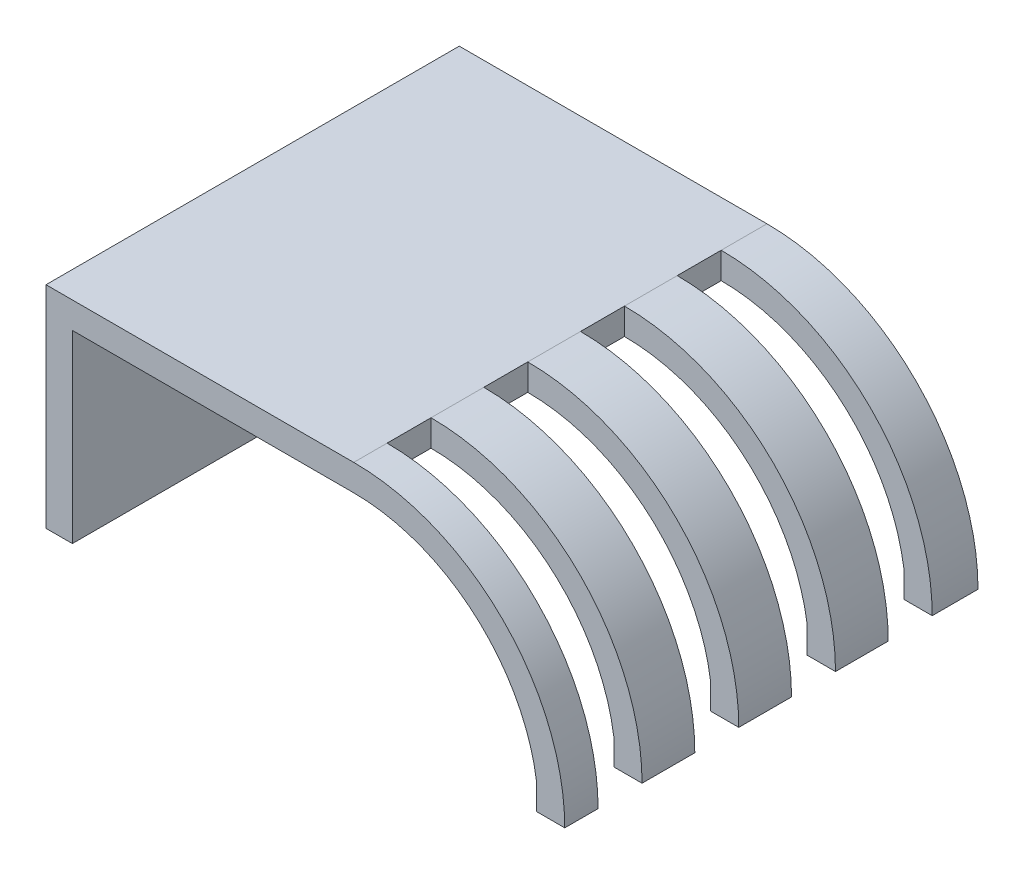
ISO-10303-21;
HEADER;
FILE_DESCRIPTION(('STEP AP214'),'2;1');
FILE_NAME('part.step','',(''),(''),'','','');
FILE_SCHEMA(('AUTOMOTIVE_DESIGN { 1 0 10303 214 1 1 1 1 }'));
ENDSEC;
DATA;
#1=APPLICATION_CONTEXT('core data for automotive mechanical design processes');
#2=APPLICATION_PROTOCOL_DEFINITION('international standard','automotive_design',2000,#1);
#3=PRODUCT_CONTEXT('',#1,'mechanical');
#4=PRODUCT('Part','Part','',(#3));
#5=PRODUCT_RELATED_PRODUCT_CATEGORY('part','',(#4));
#6=PRODUCT_DEFINITION_FORMATION('','',#4);
#7=PRODUCT_DEFINITION_CONTEXT('part definition',#1,'design');
#8=PRODUCT_DEFINITION('design','',#6,#7);
#9=PRODUCT_DEFINITION_SHAPE('','',#8);
#10=(LENGTH_UNIT() NAMED_UNIT(*) SI_UNIT(.MILLI.,.METRE.));
#11=(NAMED_UNIT(*) PLANE_ANGLE_UNIT() SI_UNIT($,.RADIAN.));
#12=(NAMED_UNIT(*) SI_UNIT($,.STERADIAN.) SOLID_ANGLE_UNIT());
#13=UNCERTAINTY_MEASURE_WITH_UNIT(LENGTH_MEASURE(1.E-05),#10,'distance_accuracy_value','');
#14=(GEOMETRIC_REPRESENTATION_CONTEXT(3) GLOBAL_UNCERTAINTY_ASSIGNED_CONTEXT((#13)) GLOBAL_UNIT_ASSIGNED_CONTEXT((#10,
#11,#12)) REPRESENTATION_CONTEXT('',''));
#15=CARTESIAN_POINT('',(0.,0.,0.));
#16=DIRECTION('',(0.,0.,1.));
#17=DIRECTION('',(1.,0.,0.));
#18=AXIS2_PLACEMENT_3D('',#15,#16,#17);
#19=CARTESIAN_POINT('',(0.,0.,0.));
#20=DIRECTION('',(0.,1.,0.));
#21=DIRECTION('',(0.,0.,1.));
#22=AXIS2_PLACEMENT_3D('',#19,#20,#21);
#23=PLANE('',#22);
#24=DIRECTION('',(0.,0.,1.));
#25=VECTOR('',#24,1.);
#26=CARTESIAN_POINT('',(12.,0.,-11.75));
#27=LINE('',#26,#25);
#28=CARTESIAN_POINT('',(12.,0.,-1.14583034009977));
#29=VERTEX_POINT('',#28);
#30=CARTESIAN_POINT('',(12.,0.,1.85416965990023));
#31=VERTEX_POINT('',#30);
#32=EDGE_CURVE('E514',#29,#31,#27,.T.);
#33=ORIENTED_EDGE('',*,*,#32,.T.);
#34=DIRECTION('',(-1.,0.,0.));
#35=VECTOR('',#34,1.);
#36=CARTESIAN_POINT('',(0.,0.,1.85416965990023));
#37=LINE('',#36,#35);
#38=CARTESIAN_POINT('',(10.3923048454133,0.,1.85416965990023));
#39=VERTEX_POINT('',#38);
#40=EDGE_CURVE('E229',#31,#39,#37,.T.);
#41=ORIENTED_EDGE('',*,*,#40,.T.);
#42=DIRECTION('',(0.,0.,-1.));
#43=VECTOR('',#42,1.);
#44=CARTESIAN_POINT('',(10.3923048454133,0.,0.));
#45=LINE('',#44,#43);
#46=CARTESIAN_POINT('',(10.3923048454133,0.,-1.14583034009977));
#47=VERTEX_POINT('',#46);
#48=EDGE_CURVE('E462',#39,#47,#45,.T.);
#49=ORIENTED_EDGE('',*,*,#48,.T.);
#50=DIRECTION('',(1.,0.,0.));
#51=VECTOR('',#50,1.);
#52=CARTESIAN_POINT('',(0.,0.,-1.14583034009977));
#53=LINE('',#52,#51);
#54=EDGE_CURVE('E289',#47,#29,#53,.T.);
#55=ORIENTED_EDGE('',*,*,#54,.T.);
#56=EDGE_LOOP('',(#33,#41,#49,#55));
#57=FACE_BOUND('',#56,.T.);
#58=ADVANCED_FACE('F32',(#57),#23,.F.);
#59=CARTESIAN_POINT('',(12.,0.,-6.64583034009977));
#60=VERTEX_POINT('',#59);
#61=CARTESIAN_POINT('',(12.,0.,-3.64583034009977));
#62=VERTEX_POINT('',#61);
#63=EDGE_CURVE('E513',#60,#62,#27,.T.);
#64=ORIENTED_EDGE('',*,*,#63,.T.);
#65=DIRECTION('',(-1.,0.,0.));
#66=VECTOR('',#65,1.);
#67=CARTESIAN_POINT('',(0.,0.,-3.64583034009977));
#68=LINE('',#67,#66);
#69=CARTESIAN_POINT('',(10.3923048454133,0.,-3.64583034009977));
#70=VERTEX_POINT('',#69);
#71=EDGE_CURVE('E293',#62,#70,#68,.T.);
#72=ORIENTED_EDGE('',*,*,#71,.T.);
#73=CARTESIAN_POINT('',(10.3923048454133,0.,-6.64583034009977));
#74=VERTEX_POINT('',#73);
#75=EDGE_CURVE('E464',#70,#74,#45,.T.);
#76=ORIENTED_EDGE('',*,*,#75,.T.);
#77=DIRECTION('',(1.,0.,0.));
#78=VECTOR('',#77,1.);
#79=CARTESIAN_POINT('',(0.,0.,-6.64583034009977));
#80=LINE('',#79,#78);
#81=EDGE_CURVE('E302',#74,#60,#80,.T.);
#82=ORIENTED_EDGE('',*,*,#81,.T.);
#83=EDGE_LOOP('',(#64,#72,#76,#82));
#84=FACE_BOUND('',#83,.T.);
#85=ADVANCED_FACE('F576',(#84),#23,.F.);
#86=CARTESIAN_POINT('',(12.,0.,-11.75));
#87=VERTEX_POINT('',#86);
#88=CARTESIAN_POINT('',(12.,0.,-9.14583034009977));
#89=VERTEX_POINT('',#88);
#90=EDGE_CURVE('E263',#87,#89,#27,.T.);
#91=ORIENTED_EDGE('',*,*,#90,.T.);
#92=DIRECTION('',(-1.,0.,0.));
#93=VECTOR('',#92,1.);
#94=CARTESIAN_POINT('',(0.,0.,-9.14583034009977));
#95=LINE('',#94,#93);
#96=CARTESIAN_POINT('',(10.3923048454133,0.,-9.14583034009977));
#97=VERTEX_POINT('',#96);
#98=EDGE_CURVE('E305',#89,#97,#95,.T.);
#99=ORIENTED_EDGE('',*,*,#98,.T.);
#100=CARTESIAN_POINT('',(10.3923048454133,0.,-11.75));
#101=VERTEX_POINT('',#100);
#102=EDGE_CURVE('E359',#97,#101,#45,.T.);
#103=ORIENTED_EDGE('',*,*,#102,.T.);
#104=DIRECTION('',(-1.,0.,0.));
#105=VECTOR('',#104,1.);
#106=CARTESIAN_POINT('',(-17.5,0.,-11.75));
#107=LINE('',#106,#105);
#108=EDGE_CURVE('E270',#87,#101,#107,.T.);
#109=ORIENTED_EDGE('',*,*,#108,.F.);
#110=EDGE_LOOP('',(#91,#99,#103,#109));
#111=FACE_BOUND('',#110,.T.);
#112=ADVANCED_FACE('F477',(#111),#23,.F.);
#113=CARTESIAN_POINT('',(0.,0.,-11.75));
#114=DIRECTION('',(0.,0.,1.));
#115=DIRECTION('',(1.,0.,0.));
#116=AXIS2_PLACEMENT_3D('',#113,#114,#115);
#117=CYLINDRICAL_SURFACE('',#116,12.);
#118=CARTESIAN_POINT('',(0.,0.,1.85416965990023));
#119=DIRECTION('',(0.,0.,-1.));
#120=DIRECTION('',(-1.,0.,0.));
#121=AXIS2_PLACEMENT_3D('',#118,#119,#120);
#122=CIRCLE('',#121,12.);
#123=CARTESIAN_POINT('',(0.,12.,1.85416965990023));
#124=VERTEX_POINT('',#123);
#125=EDGE_CURVE('E331',#31,#124,#122,.F.);
#126=ORIENTED_EDGE('',*,*,#125,.F.);
#127=ORIENTED_EDGE('',*,*,#32,.F.);
#128=CARTESIAN_POINT('',(0.,0.,-1.14583034009977));
#129=DIRECTION('',(0.,0.,1.));
#130=DIRECTION('',(1.,0.,0.));
#131=AXIS2_PLACEMENT_3D('',#128,#129,#130);
#132=CIRCLE('',#131,12.);
#133=CARTESIAN_POINT('',(0.,12.,-1.14583034009977));
#134=VERTEX_POINT('',#133);
#135=EDGE_CURVE('E322',#134,#29,#132,.F.);
#136=ORIENTED_EDGE('',*,*,#135,.F.);
#137=DIRECTION('',(0.,0.,1.));
#138=VECTOR('',#137,1.);
#139=CARTESIAN_POINT('',(0.,12.,-11.75));
#140=LINE('',#139,#138);
#141=EDGE_CURVE('E258',#134,#124,#140,.T.);
#142=ORIENTED_EDGE('',*,*,#141,.T.);
#143=EDGE_LOOP('',(#126,#127,#136,#142));
#144=FACE_BOUND('',#143,.T.);
#145=ADVANCED_FACE('F519',(#144),#117,.T.);
#146=CARTESIAN_POINT('',(0.,0.,-3.64583034009977));
#147=DIRECTION('',(0.,0.,-1.));
#148=DIRECTION('',(-1.,0.,0.));
#149=AXIS2_PLACEMENT_3D('',#146,#147,#148);
#150=CIRCLE('',#149,12.);
#151=CARTESIAN_POINT('',(0.,12.,-3.64583034009977));
#152=VERTEX_POINT('',#151);
#153=EDGE_CURVE('E279',#62,#152,#150,.F.);
#154=ORIENTED_EDGE('',*,*,#153,.F.);
#155=ORIENTED_EDGE('',*,*,#63,.F.);
#156=CARTESIAN_POINT('',(0.,0.,-6.64583034009977));
#157=DIRECTION('',(0.,0.,1.));
#158=DIRECTION('',(1.,0.,0.));
#159=AXIS2_PLACEMENT_3D('',#156,#157,#158);
#160=CIRCLE('',#159,12.);
#161=CARTESIAN_POINT('',(0.,12.,-6.64583034009977));
#162=VERTEX_POINT('',#161);
#163=EDGE_CURVE('E281',#162,#60,#160,.F.);
#164=ORIENTED_EDGE('',*,*,#163,.F.);
#165=EDGE_CURVE('E262',#162,#152,#140,.T.);
#166=ORIENTED_EDGE('',*,*,#165,.T.);
#167=EDGE_LOOP('',(#154,#155,#164,#166));
#168=FACE_BOUND('',#167,.T.);
#169=ADVANCED_FACE('F277',(#168),#117,.T.);
#170=CARTESIAN_POINT('',(0.,0.,-9.14583034009977));
#171=DIRECTION('',(0.,0.,-1.));
#172=DIRECTION('',(-1.,0.,0.));
#173=AXIS2_PLACEMENT_3D('',#170,#171,#172);
#174=CIRCLE('',#173,12.);
#175=CARTESIAN_POINT('',(0.,12.,-9.14583034009977));
#176=VERTEX_POINT('',#175);
#177=EDGE_CURVE('E317',#89,#176,#174,.F.);
#178=ORIENTED_EDGE('',*,*,#177,.F.);
#179=ORIENTED_EDGE('',*,*,#90,.F.);
#180=CARTESIAN_POINT('',(0.,0.,-11.75));
#181=DIRECTION('',(0.,0.,1.));
#182=DIRECTION('',(1.,0.,0.));
#183=AXIS2_PLACEMENT_3D('',#180,#181,#182);
#184=CIRCLE('',#183,12.);
#185=CARTESIAN_POINT('',(0.,12.,-11.75));
#186=VERTEX_POINT('',#185);
#187=EDGE_CURVE('E401',#87,#186,#184,.T.);
#188=ORIENTED_EDGE('',*,*,#187,.T.);
#189=EDGE_CURVE('E261',#186,#176,#140,.T.);
#190=ORIENTED_EDGE('',*,*,#189,.T.);
#191=EDGE_LOOP('',(#178,#179,#188,#190));
#192=FACE_BOUND('',#191,.T.);
#193=ADVANCED_FACE('F485',(#192),#117,.T.);
#194=CARTESIAN_POINT('',(0.,0.,-11.75));
#195=DIRECTION('',(0.,0.,1.));
#196=DIRECTION('',(1.,0.,0.));
#197=AXIS2_PLACEMENT_3D('',#194,#195,#196);
#198=CYLINDRICAL_SURFACE('',#197,10.5);
#199=DIRECTION('',(0.,0.,1.));
#200=VECTOR('',#199,1.);
#201=CARTESIAN_POINT('',(10.3923048454133,1.5,-11.75));
#202=LINE('',#201,#200);
#203=CARTESIAN_POINT('',(10.3923048454133,1.5,-1.14583034009977));
#204=VERTEX_POINT('',#203);
#205=CARTESIAN_POINT('',(10.3923048454133,1.5,1.85416965990023));
#206=VERTEX_POINT('',#205);
#207=EDGE_CURVE('E529',#204,#206,#202,.T.);
#208=ORIENTED_EDGE('',*,*,#207,.T.);
#209=CARTESIAN_POINT('',(0.,0.,1.85416965990023));
#210=DIRECTION('',(0.,0.,-1.));
#211=DIRECTION('',(-1.,0.,0.));
#212=AXIS2_PLACEMENT_3D('',#209,#210,#211);
#213=CIRCLE('',#212,10.5);
#214=CARTESIAN_POINT('',(0.,10.5,1.85416965990023));
#215=VERTEX_POINT('',#214);
#216=EDGE_CURVE('E250',#206,#215,#213,.F.);
#217=ORIENTED_EDGE('',*,*,#216,.T.);
#218=DIRECTION('',(0.,0.,1.));
#219=VECTOR('',#218,1.);
#220=CARTESIAN_POINT('',(0.,10.5,-11.75));
#221=LINE('',#220,#219);
#222=CARTESIAN_POINT('',(0.,10.5,-1.14583034009977));
#223=VERTEX_POINT('',#222);
#224=EDGE_CURVE('E546',#223,#215,#221,.T.);
#225=ORIENTED_EDGE('',*,*,#224,.F.);
#226=CARTESIAN_POINT('',(0.,0.,-1.14583034009977));
#227=DIRECTION('',(0.,0.,1.));
#228=DIRECTION('',(1.,0.,0.));
#229=AXIS2_PLACEMENT_3D('',#226,#227,#228);
#230=CIRCLE('',#229,10.5);
#231=EDGE_CURVE('E319',#223,#204,#230,.F.);
#232=ORIENTED_EDGE('',*,*,#231,.T.);
#233=EDGE_LOOP('',(#208,#217,#225,#232));
#234=FACE_BOUND('',#233,.T.);
#235=ADVANCED_FACE('F531',(#234),#198,.F.);
#236=CARTESIAN_POINT('',(10.3923048454133,1.5,-6.64583034009977));
#237=VERTEX_POINT('',#236);
#238=CARTESIAN_POINT('',(10.3923048454133,1.5,-3.64583034009977));
#239=VERTEX_POINT('',#238);
#240=EDGE_CURVE('E399',#237,#239,#202,.T.);
#241=ORIENTED_EDGE('',*,*,#240,.T.);
#242=CARTESIAN_POINT('',(0.,0.,-3.64583034009977));
#243=DIRECTION('',(0.,0.,-1.));
#244=DIRECTION('',(-1.,0.,0.));
#245=AXIS2_PLACEMENT_3D('',#242,#243,#244);
#246=CIRCLE('',#245,10.5);
#247=CARTESIAN_POINT('',(0.,10.5,-3.64583034009977));
#248=VERTEX_POINT('',#247);
#249=EDGE_CURVE('E324',#239,#248,#246,.F.);
#250=ORIENTED_EDGE('',*,*,#249,.T.);
#251=CARTESIAN_POINT('',(0.,10.5,-6.64583034009977));
#252=VERTEX_POINT('',#251);
#253=EDGE_CURVE('E549',#252,#248,#221,.T.);
#254=ORIENTED_EDGE('',*,*,#253,.F.);
#255=CARTESIAN_POINT('',(0.,0.,-6.64583034009977));
#256=DIRECTION('',(0.,0.,1.));
#257=DIRECTION('',(1.,0.,0.));
#258=AXIS2_PLACEMENT_3D('',#255,#256,#257);
#259=CIRCLE('',#258,10.5);
#260=EDGE_CURVE('E310',#252,#237,#259,.F.);
#261=ORIENTED_EDGE('',*,*,#260,.T.);
#262=EDGE_LOOP('',(#241,#250,#254,#261));
#263=FACE_BOUND('',#262,.T.);
#264=ADVANCED_FACE('F563',(#263),#198,.F.);
#265=CARTESIAN_POINT('',(10.3923048454133,1.5,-11.75));
#266=VERTEX_POINT('',#265);
#267=CARTESIAN_POINT('',(10.3923048454133,1.5,-9.14583034009977));
#268=VERTEX_POINT('',#267);
#269=EDGE_CURVE('E395',#266,#268,#202,.T.);
#270=ORIENTED_EDGE('',*,*,#269,.T.);
#271=CARTESIAN_POINT('',(0.,0.,-9.14583034009977));
#272=DIRECTION('',(0.,0.,-1.));
#273=DIRECTION('',(-1.,0.,0.));
#274=AXIS2_PLACEMENT_3D('',#271,#272,#273);
#275=CIRCLE('',#274,10.5);
#276=CARTESIAN_POINT('',(0.,10.5,-9.14583034009977));
#277=VERTEX_POINT('',#276);
#278=EDGE_CURVE('E314',#268,#277,#275,.F.);
#279=ORIENTED_EDGE('',*,*,#278,.T.);
#280=CARTESIAN_POINT('',(0.,10.5,-11.75));
#281=VERTEX_POINT('',#280);
#282=EDGE_CURVE('E389',#281,#277,#221,.T.);
#283=ORIENTED_EDGE('',*,*,#282,.F.);
#284=CARTESIAN_POINT('',(0.,0.,-11.75));
#285=DIRECTION('',(0.,0.,1.));
#286=DIRECTION('',(1.,0.,0.));
#287=AXIS2_PLACEMENT_3D('',#284,#285,#286);
#288=CIRCLE('',#287,10.5);
#289=EDGE_CURVE('E370',#266,#281,#288,.T.);
#290=ORIENTED_EDGE('',*,*,#289,.F.);
#291=EDGE_LOOP('',(#270,#279,#283,#290));
#292=FACE_BOUND('',#291,.T.);
#293=ADVANCED_FACE('F561',(#292),#198,.F.);
#294=CARTESIAN_POINT('',(10.3923048454133,-10.5,-11.75));
#295=DIRECTION('',(1.,0.,0.));
#296=DIRECTION('',(0.,0.,-1.));
#297=AXIS2_PLACEMENT_3D('',#294,#295,#296);
#298=PLANE('',#297);
#299=ORIENTED_EDGE('',*,*,#48,.F.);
#300=DIRECTION('',(0.,1.,0.));
#301=VECTOR('',#300,1.);
#302=CARTESIAN_POINT('',(10.3923048454133,-10.5,1.85416965990023));
#303=LINE('',#302,#301);
#304=EDGE_CURVE('E11',#39,#206,#303,.T.);
#305=ORIENTED_EDGE('',*,*,#304,.T.);
#306=ORIENTED_EDGE('',*,*,#207,.F.);
#307=DIRECTION('',(0.,-1.,0.));
#308=VECTOR('',#307,1.);
#309=CARTESIAN_POINT('',(10.3923048454133,-10.5,-1.14583034009977));
#310=LINE('',#309,#308);
#311=EDGE_CURVE('E448',#204,#47,#310,.T.);
#312=ORIENTED_EDGE('',*,*,#311,.T.);
#313=EDGE_LOOP('',(#299,#305,#306,#312));
#314=FACE_BOUND('',#313,.T.);
#315=ADVANCED_FACE('F528',(#314),#298,.F.);
#316=ORIENTED_EDGE('',*,*,#75,.F.);
#317=DIRECTION('',(0.,1.,0.));
#318=VECTOR('',#317,1.);
#319=CARTESIAN_POINT('',(10.3923048454133,-10.5,-3.64583034009977));
#320=LINE('',#319,#318);
#321=EDGE_CURVE('E451',#70,#239,#320,.T.);
#322=ORIENTED_EDGE('',*,*,#321,.T.);
#323=ORIENTED_EDGE('',*,*,#240,.F.);
#324=DIRECTION('',(0.,-1.,0.));
#325=VECTOR('',#324,1.);
#326=CARTESIAN_POINT('',(10.3923048454133,-10.5,-6.64583034009977));
#327=LINE('',#326,#325);
#328=EDGE_CURVE('E442',#237,#74,#327,.T.);
#329=ORIENTED_EDGE('',*,*,#328,.T.);
#330=EDGE_LOOP('',(#316,#322,#323,#329));
#331=FACE_BOUND('',#330,.T.);
#332=ADVANCED_FACE('F569',(#331),#298,.F.);
#333=ORIENTED_EDGE('',*,*,#102,.F.);
#334=DIRECTION('',(0.,1.,0.));
#335=VECTOR('',#334,1.);
#336=CARTESIAN_POINT('',(10.3923048454133,-10.5,-9.14583034009977));
#337=LINE('',#336,#335);
#338=EDGE_CURVE('E445',#97,#268,#337,.T.);
#339=ORIENTED_EDGE('',*,*,#338,.T.);
#340=ORIENTED_EDGE('',*,*,#269,.F.);
#341=DIRECTION('',(0.,1.,0.));
#342=VECTOR('',#341,1.);
#343=CARTESIAN_POINT('',(10.3923048454133,-10.5,-11.75));
#344=LINE('',#343,#342);
#345=EDGE_CURVE('E356',#101,#266,#344,.T.);
#346=ORIENTED_EDGE('',*,*,#345,.F.);
#347=EDGE_LOOP('',(#333,#339,#340,#346));
#348=FACE_BOUND('',#347,.T.);
#349=ADVANCED_FACE('F479',(#348),#298,.F.);
#350=CARTESIAN_POINT('',(10.3923048454133,0.,7.35416965990023));
#351=VERTEX_POINT('',#350);
#352=CARTESIAN_POINT('',(10.3923048454133,0.,4.35416965990023));
#353=VERTEX_POINT('',#352);
#354=EDGE_CURVE('E366',#351,#353,#45,.T.);
#355=ORIENTED_EDGE('',*,*,#354,.T.);
#356=DIRECTION('',(1.,0.,0.));
#357=VECTOR('',#356,1.);
#358=CARTESIAN_POINT('',(0.,0.,4.35416965990023));
#359=LINE('',#358,#357);
#360=CARTESIAN_POINT('',(12.,0.,4.35416965990023));
#361=VERTEX_POINT('',#360);
#362=EDGE_CURVE('E240',#353,#361,#359,.T.);
#363=ORIENTED_EDGE('',*,*,#362,.T.);
#364=CARTESIAN_POINT('',(12.,0.,7.35416965990023));
#365=VERTEX_POINT('',#364);
#366=EDGE_CURVE('E249',#361,#365,#27,.T.);
#367=ORIENTED_EDGE('',*,*,#366,.T.);
#368=DIRECTION('',(-1.,0.,0.));
#369=VECTOR('',#368,1.);
#370=CARTESIAN_POINT('',(0.,0.,7.35416965990023));
#371=LINE('',#370,#369);
#372=EDGE_CURVE('E336',#365,#351,#371,.T.);
#373=ORIENTED_EDGE('',*,*,#372,.T.);
#374=EDGE_LOOP('',(#355,#363,#367,#373));
#375=FACE_BOUND('',#374,.T.);
#376=ADVANCED_FACE('F460',(#375),#23,.F.);
#377=CARTESIAN_POINT('',(0.,0.,4.35416965990023));
#378=DIRECTION('',(0.,0.,1.));
#379=DIRECTION('',(1.,0.,0.));
#380=AXIS2_PLACEMENT_3D('',#377,#378,#379);
#381=CIRCLE('',#380,12.);
#382=CARTESIAN_POINT('',(0.,12.,4.35416965990023));
#383=VERTEX_POINT('',#382);
#384=EDGE_CURVE('E223',#383,#361,#381,.F.);
#385=ORIENTED_EDGE('',*,*,#384,.F.);
#386=CARTESIAN_POINT('',(0.,12.,7.35416965990023));
#387=VERTEX_POINT('',#386);
#388=EDGE_CURVE('E247',#383,#387,#140,.T.);
#389=ORIENTED_EDGE('',*,*,#388,.T.);
#390=CARTESIAN_POINT('',(0.,0.,7.35416965990023));
#391=DIRECTION('',(0.,0.,-1.));
#392=DIRECTION('',(-1.,0.,0.));
#393=AXIS2_PLACEMENT_3D('',#390,#391,#392);
#394=CIRCLE('',#393,12.);
#395=EDGE_CURVE('E353',#365,#387,#394,.F.);
#396=ORIENTED_EDGE('',*,*,#395,.F.);
#397=ORIENTED_EDGE('',*,*,#366,.F.);
#398=EDGE_LOOP('',(#385,#389,#396,#397));
#399=FACE_BOUND('',#398,.T.);
#400=ADVANCED_FACE('F245',(#399),#117,.T.);
#401=CARTESIAN_POINT('',(0.,10.5,4.35416965990023));
#402=VERTEX_POINT('',#401);
#403=CARTESIAN_POINT('',(0.,10.5,7.35416965990023));
#404=VERTEX_POINT('',#403);
#405=EDGE_CURVE('E393',#402,#404,#221,.T.);
#406=ORIENTED_EDGE('',*,*,#405,.F.);
#407=CARTESIAN_POINT('',(0.,0.,4.35416965990023));
#408=DIRECTION('',(0.,0.,1.));
#409=DIRECTION('',(1.,0.,0.));
#410=AXIS2_PLACEMENT_3D('',#407,#408,#409);
#411=CIRCLE('',#410,10.5);
#412=CARTESIAN_POINT('',(10.3923048454133,1.5,4.35416965990023));
#413=VERTEX_POINT('',#412);
#414=EDGE_CURVE('E226',#402,#413,#411,.F.);
#415=ORIENTED_EDGE('',*,*,#414,.T.);
#416=CARTESIAN_POINT('',(10.3923048454133,1.5,7.35416965990023));
#417=VERTEX_POINT('',#416);
#418=EDGE_CURVE('E400',#413,#417,#202,.T.);
#419=ORIENTED_EDGE('',*,*,#418,.T.);
#420=CARTESIAN_POINT('',(0.,0.,7.35416965990023));
#421=DIRECTION('',(0.,0.,-1.));
#422=DIRECTION('',(-1.,0.,0.));
#423=AXIS2_PLACEMENT_3D('',#420,#421,#422);
#424=CIRCLE('',#423,10.5);
#425=EDGE_CURVE('E350',#417,#404,#424,.F.);
#426=ORIENTED_EDGE('',*,*,#425,.T.);
#427=EDGE_LOOP('',(#406,#415,#419,#426));
#428=FACE_BOUND('',#427,.T.);
#429=ADVANCED_FACE('F537',(#428),#198,.F.);
#430=ORIENTED_EDGE('',*,*,#418,.F.);
#431=DIRECTION('',(0.,-1.,0.));
#432=VECTOR('',#431,1.);
#433=CARTESIAN_POINT('',(10.3923048454133,-10.5,4.35416965990023));
#434=LINE('',#433,#432);
#435=EDGE_CURVE('E40',#413,#353,#434,.T.);
#436=ORIENTED_EDGE('',*,*,#435,.T.);
#437=ORIENTED_EDGE('',*,*,#354,.F.);
#438=DIRECTION('',(0.,1.,0.));
#439=VECTOR('',#438,1.);
#440=CARTESIAN_POINT('',(10.3923048454133,-10.5,7.35416965990023));
#441=LINE('',#440,#439);
#442=EDGE_CURVE('E439',#351,#417,#441,.T.);
#443=ORIENTED_EDGE('',*,*,#442,.T.);
#444=EDGE_LOOP('',(#430,#436,#437,#443));
#445=FACE_BOUND('',#444,.T.);
#446=ADVANCED_FACE('F458',(#445),#298,.F.);
#447=CARTESIAN_POINT('',(-16.,0.,-11.75));
#448=VERTEX_POINT('',#447);
#449=CARTESIAN_POINT('',(-17.5,0.,-11.75));
#450=VERTEX_POINT('',#449);
#451=EDGE_CURVE('E267',#448,#450,#107,.T.);
#452=ORIENTED_EDGE('',*,*,#451,.F.);
#453=DIRECTION('',(0.,0.,1.));
#454=VECTOR('',#453,1.);
#455=CARTESIAN_POINT('',(-16.,0.,0.));
#456=LINE('',#455,#454);
#457=CARTESIAN_POINT('',(-16.,0.,11.75));
#458=VERTEX_POINT('',#457);
#459=EDGE_CURVE('E365',#448,#458,#456,.T.);
#460=ORIENTED_EDGE('',*,*,#459,.T.);
#461=DIRECTION('',(1.,0.,0.));
#462=VECTOR('',#461,1.);
#463=CARTESIAN_POINT('',(-17.5,0.,11.75));
#464=LINE('',#463,#462);
#465=CARTESIAN_POINT('',(-17.5,0.,11.75));
#466=VERTEX_POINT('',#465);
#467=EDGE_CURVE('E432',#466,#458,#464,.T.);
#468=ORIENTED_EDGE('',*,*,#467,.F.);
#469=DIRECTION('',(0.,0.,1.));
#470=VECTOR('',#469,1.);
#471=CARTESIAN_POINT('',(-17.5,0.,-11.75));
#472=LINE('',#471,#470);
#473=EDGE_CURVE('E430',#450,#466,#472,.T.);
#474=ORIENTED_EDGE('',*,*,#473,.F.);
#475=EDGE_LOOP('',(#452,#460,#468,#474));
#476=FACE_BOUND('',#475,.T.);
#477=ADVANCED_FACE('F493',(#476),#23,.F.);
#478=CARTESIAN_POINT('',(-17.5,12.,-11.75));
#479=DIRECTION('',(0.,0.,1.));
#480=DIRECTION('',(1.,0.,0.));
#481=AXIS2_PLACEMENT_3D('',#478,#479,#480);
#482=PLANE('',#481);
#483=DIRECTION('',(0.,-1.,0.));
#484=VECTOR('',#483,1.);
#485=CARTESIAN_POINT('',(-16.,0.,-11.75));
#486=LINE('',#485,#484);
#487=CARTESIAN_POINT('',(-16.,10.5,-11.75));
#488=VERTEX_POINT('',#487);
#489=EDGE_CURVE('E377',#488,#448,#486,.T.);
#490=ORIENTED_EDGE('',*,*,#489,.T.);
#491=ORIENTED_EDGE('',*,*,#451,.T.);
#492=DIRECTION('',(0.,-1.,0.));
#493=VECTOR('',#492,1.);
#494=CARTESIAN_POINT('',(-17.5,12.,-11.75));
#495=LINE('',#494,#493);
#496=CARTESIAN_POINT('',(-17.5,12.,-11.75));
#497=VERTEX_POINT('',#496);
#498=EDGE_CURVE('E423',#497,#450,#495,.T.);
#499=ORIENTED_EDGE('',*,*,#498,.F.);
#500=DIRECTION('',(-1.,0.,0.));
#501=VECTOR('',#500,1.);
#502=CARTESIAN_POINT('',(-17.5,12.,-11.75));
#503=LINE('',#502,#501);
#504=EDGE_CURVE('E425',#186,#497,#503,.T.);
#505=ORIENTED_EDGE('',*,*,#504,.F.);
#506=ORIENTED_EDGE('',*,*,#187,.F.);
#507=ORIENTED_EDGE('',*,*,#108,.T.);
#508=ORIENTED_EDGE('',*,*,#345,.T.);
#509=ORIENTED_EDGE('',*,*,#289,.T.);
#510=DIRECTION('',(-1.,0.,0.));
#511=VECTOR('',#510,1.);
#512=CARTESIAN_POINT('',(0.,10.5,-11.75));
#513=LINE('',#512,#511);
#514=EDGE_CURVE('E373',#281,#488,#513,.T.);
#515=ORIENTED_EDGE('',*,*,#514,.T.);
#516=EDGE_LOOP('',(#490,#491,#499,#505,#506,#507,#508,#509,#515));
#517=FACE_BOUND('',#516,.T.);
#518=ADVANCED_FACE('F34',(#517),#482,.F.);
#519=CARTESIAN_POINT('',(-17.5,12.,11.75));
#520=DIRECTION('',(0.,0.,-1.));
#521=DIRECTION('',(-1.,0.,0.));
#522=AXIS2_PLACEMENT_3D('',#519,#520,#521);
#523=PLANE('',#522);
#524=ORIENTED_EDGE('',*,*,#467,.T.);
#525=DIRECTION('',(0.,-1.,0.));
#526=VECTOR('',#525,1.);
#527=CARTESIAN_POINT('',(-16.,0.,11.75));
#528=LINE('',#527,#526);
#529=CARTESIAN_POINT('',(-16.,10.5,11.75));
#530=VERTEX_POINT('',#529);
#531=EDGE_CURVE('E374',#530,#458,#528,.T.);
#532=ORIENTED_EDGE('',*,*,#531,.F.);
#533=DIRECTION('',(-1.,0.,0.));
#534=VECTOR('',#533,1.);
#535=CARTESIAN_POINT('',(0.,10.5,11.75));
#536=LINE('',#535,#534);
#537=CARTESIAN_POINT('',(0.,10.5,11.75));
#538=VERTEX_POINT('',#537);
#539=EDGE_CURVE('E382',#538,#530,#536,.T.);
#540=ORIENTED_EDGE('',*,*,#539,.F.);
#541=CARTESIAN_POINT('',(0.,0.,11.75));
#542=DIRECTION('',(0.,0.,1.));
#543=DIRECTION('',(1.,0.,0.));
#544=AXIS2_PLACEMENT_3D('',#541,#542,#543);
#545=CIRCLE('',#544,10.5);
#546=CARTESIAN_POINT('',(10.3923048454133,1.5,11.75));
#547=VERTEX_POINT('',#546);
#548=EDGE_CURVE('E369',#547,#538,#545,.T.);
#549=ORIENTED_EDGE('',*,*,#548,.F.);
#550=DIRECTION('',(0.,1.,0.));
#551=VECTOR('',#550,1.);
#552=CARTESIAN_POINT('',(10.3923048454133,-10.5,11.75));
#553=LINE('',#552,#551);
#554=CARTESIAN_POINT('',(10.3923048454133,0.,11.75));
#555=VERTEX_POINT('',#554);
#556=EDGE_CURVE('E355',#555,#547,#553,.T.);
#557=ORIENTED_EDGE('',*,*,#556,.F.);
#558=CARTESIAN_POINT('',(12.,0.,11.75));
#559=VERTEX_POINT('',#558);
#560=EDGE_CURVE('E415',#555,#559,#464,.T.);
#561=ORIENTED_EDGE('',*,*,#560,.T.);
#562=CARTESIAN_POINT('',(0.,0.,11.75));
#563=DIRECTION('',(0.,0.,1.));
#564=DIRECTION('',(1.,0.,0.));
#565=AXIS2_PLACEMENT_3D('',#562,#563,#564);
#566=CIRCLE('',#565,12.);
#567=CARTESIAN_POINT('',(0.,12.,11.75));
#568=VERTEX_POINT('',#567);
#569=EDGE_CURVE('E388',#559,#568,#566,.T.);
#570=ORIENTED_EDGE('',*,*,#569,.T.);
#571=DIRECTION('',(1.,0.,0.));
#572=VECTOR('',#571,1.);
#573=CARTESIAN_POINT('',(-17.5,12.,11.75));
#574=LINE('',#573,#572);
#575=CARTESIAN_POINT('',(-17.5,12.,11.75));
#576=VERTEX_POINT('',#575);
#577=EDGE_CURVE('E412',#576,#568,#574,.T.);
#578=ORIENTED_EDGE('',*,*,#577,.F.);
#579=DIRECTION('',(0.,-1.,0.));
#580=VECTOR('',#579,1.);
#581=CARTESIAN_POINT('',(-17.5,12.,11.75));
#582=LINE('',#581,#580);
#583=EDGE_CURVE('E421',#576,#466,#582,.T.);
#584=ORIENTED_EDGE('',*,*,#583,.T.);
#585=EDGE_LOOP('',(#524,#532,#540,#549,#557,#561,#570,#578,#584));
#586=FACE_BOUND('',#585,.T.);
#587=ADVANCED_FACE('F410',(#586),#523,.F.);
#588=CARTESIAN_POINT('',(10.3923048454133,0.,9.85416965990023));
#589=VERTEX_POINT('',#588);
#590=EDGE_CURVE('E362',#555,#589,#45,.T.);
#591=ORIENTED_EDGE('',*,*,#590,.T.);
#592=DIRECTION('',(1.,0.,0.));
#593=VECTOR('',#592,1.);
#594=CARTESIAN_POINT('',(0.,0.,9.85416965990023));
#595=LINE('',#594,#593);
#596=CARTESIAN_POINT('',(12.,0.,9.85416965990023));
#597=VERTEX_POINT('',#596);
#598=EDGE_CURVE('E333',#589,#597,#595,.T.);
#599=ORIENTED_EDGE('',*,*,#598,.T.);
#600=EDGE_CURVE('E402',#597,#559,#27,.T.);
#601=ORIENTED_EDGE('',*,*,#600,.T.);
#602=ORIENTED_EDGE('',*,*,#560,.F.);
#603=EDGE_LOOP('',(#591,#599,#601,#602));
#604=FACE_BOUND('',#603,.T.);
#605=ADVANCED_FACE('F511',(#604),#23,.F.);
#606=CARTESIAN_POINT('',(-17.5,12.,-11.75));
#607=DIRECTION('',(1.,0.,0.));
#608=DIRECTION('',(0.,0.,-1.));
#609=AXIS2_PLACEMENT_3D('',#606,#607,#608);
#610=PLANE('',#609);
#611=ORIENTED_EDGE('',*,*,#473,.T.);
#612=ORIENTED_EDGE('',*,*,#583,.F.);
#613=DIRECTION('',(0.,0.,1.));
#614=VECTOR('',#613,1.);
#615=CARTESIAN_POINT('',(-17.5,12.,-11.75));
#616=LINE('',#615,#614);
#617=EDGE_CURVE('E419',#497,#576,#616,.T.);
#618=ORIENTED_EDGE('',*,*,#617,.F.);
#619=ORIENTED_EDGE('',*,*,#498,.T.);
#620=EDGE_LOOP('',(#611,#612,#618,#619));
#621=FACE_BOUND('',#620,.T.);
#622=ADVANCED_FACE('F489',(#621),#610,.F.);
#623=CARTESIAN_POINT('',(0.,12.,0.));
#624=DIRECTION('',(0.,1.,0.));
#625=DIRECTION('',(0.,0.,1.));
#626=AXIS2_PLACEMENT_3D('',#623,#624,#625);
#627=PLANE('',#626);
#628=ORIENTED_EDGE('',*,*,#189,.F.);
#629=ORIENTED_EDGE('',*,*,#504,.T.);
#630=ORIENTED_EDGE('',*,*,#617,.T.);
#631=ORIENTED_EDGE('',*,*,#577,.T.);
#632=CARTESIAN_POINT('',(0.,12.,9.85416965990023));
#633=VERTEX_POINT('',#632);
#634=EDGE_CURVE('E259',#633,#568,#140,.T.);
#635=ORIENTED_EDGE('',*,*,#634,.F.);
#636=DIRECTION('',(0.,0.,1.));
#637=VECTOR('',#636,1.);
#638=CARTESIAN_POINT('',(0.,12.,9.85416965990023));
#639=LINE('',#638,#637);
#640=EDGE_CURVE('E257',#387,#633,#639,.T.);
#641=ORIENTED_EDGE('',*,*,#640,.F.);
#642=ORIENTED_EDGE('',*,*,#388,.F.);
#643=DIRECTION('',(0.,0.,1.));
#644=VECTOR('',#643,1.);
#645=CARTESIAN_POINT('',(0.,12.,4.35416965990023));
#646=LINE('',#645,#644);
#647=EDGE_CURVE('E233',#124,#383,#646,.T.);
#648=ORIENTED_EDGE('',*,*,#647,.F.);
#649=ORIENTED_EDGE('',*,*,#141,.F.);
#650=DIRECTION('',(0.,0.,1.));
#651=VECTOR('',#650,1.);
#652=CARTESIAN_POINT('',(0.,12.,-1.14583034009977));
#653=LINE('',#652,#651);
#654=EDGE_CURVE('E286',#152,#134,#653,.T.);
#655=ORIENTED_EDGE('',*,*,#654,.F.);
#656=ORIENTED_EDGE('',*,*,#165,.F.);
#657=DIRECTION('',(0.,0.,1.));
#658=VECTOR('',#657,1.);
#659=CARTESIAN_POINT('',(0.,12.,-6.64583034009977));
#660=LINE('',#659,#658);
#661=EDGE_CURVE('E285',#176,#162,#660,.T.);
#662=ORIENTED_EDGE('',*,*,#661,.F.);
#663=EDGE_LOOP('',(#628,#629,#630,#631,#635,#641,#642,#648,#649,#655,#656,#662));
#664=FACE_BOUND('',#663,.T.);
#665=ADVANCED_FACE('F254',(#664),#627,.T.);
#666=CARTESIAN_POINT('',(0.,0.,9.85416965990023));
#667=DIRECTION('',(0.,0.,1.));
#668=DIRECTION('',(1.,0.,0.));
#669=AXIS2_PLACEMENT_3D('',#666,#667,#668);
#670=CIRCLE('',#669,12.);
#671=EDGE_CURVE('E348',#633,#597,#670,.F.);
#672=ORIENTED_EDGE('',*,*,#671,.F.);
#673=ORIENTED_EDGE('',*,*,#634,.T.);
#674=ORIENTED_EDGE('',*,*,#569,.F.);
#675=ORIENTED_EDGE('',*,*,#600,.F.);
#676=EDGE_LOOP('',(#672,#673,#674,#675));
#677=FACE_BOUND('',#676,.T.);
#678=ADVANCED_FACE('F598',(#677),#117,.T.);
#679=CARTESIAN_POINT('',(-16.,0.,-11.75));
#680=DIRECTION('',(-1.,0.,0.));
#681=DIRECTION('',(0.,0.,1.));
#682=AXIS2_PLACEMENT_3D('',#679,#680,#681);
#683=PLANE('',#682);
#684=ORIENTED_EDGE('',*,*,#531,.T.);
#685=ORIENTED_EDGE('',*,*,#459,.F.);
#686=ORIENTED_EDGE('',*,*,#489,.F.);
#687=DIRECTION('',(0.,0.,1.));
#688=VECTOR('',#687,1.);
#689=CARTESIAN_POINT('',(-16.,10.5,-11.75));
#690=LINE('',#689,#688);
#691=EDGE_CURVE('E386',#488,#530,#690,.T.);
#692=ORIENTED_EDGE('',*,*,#691,.T.);
#693=EDGE_LOOP('',(#684,#685,#686,#692));
#694=FACE_BOUND('',#693,.T.);
#695=ADVANCED_FACE('F497',(#694),#683,.F.);
#696=CARTESIAN_POINT('',(0.,10.5,-11.75));
#697=DIRECTION('',(0.,1.,0.));
#698=DIRECTION('',(0.,0.,1.));
#699=AXIS2_PLACEMENT_3D('',#696,#697,#698);
#700=PLANE('',#699);
#701=ORIENTED_EDGE('',*,*,#539,.T.);
#702=ORIENTED_EDGE('',*,*,#691,.F.);
#703=ORIENTED_EDGE('',*,*,#514,.F.);
#704=ORIENTED_EDGE('',*,*,#282,.T.);
#705=EDGE_CURVE('E392',#277,#252,#221,.T.);
#706=ORIENTED_EDGE('',*,*,#705,.T.);
#707=ORIENTED_EDGE('',*,*,#253,.T.);
#708=EDGE_CURVE('E547',#248,#223,#221,.T.);
#709=ORIENTED_EDGE('',*,*,#708,.T.);
#710=ORIENTED_EDGE('',*,*,#224,.T.);
#711=EDGE_CURVE('E544',#215,#402,#221,.T.);
#712=ORIENTED_EDGE('',*,*,#711,.T.);
#713=ORIENTED_EDGE('',*,*,#405,.T.);
#714=CARTESIAN_POINT('',(0.,10.5,9.85416965990023));
#715=VERTEX_POINT('',#714);
#716=EDGE_CURVE('E394',#404,#715,#221,.T.);
#717=ORIENTED_EDGE('',*,*,#716,.T.);
#718=EDGE_CURVE('E398',#715,#538,#221,.T.);
#719=ORIENTED_EDGE('',*,*,#718,.T.);
#720=EDGE_LOOP('',(#701,#702,#703,#704,#706,#707,#709,#710,#712,#713,#717,#719));
#721=FACE_BOUND('',#720,.T.);
#722=ADVANCED_FACE('F501',(#721),#700,.F.);
#723=ORIENTED_EDGE('',*,*,#718,.F.);
#724=CARTESIAN_POINT('',(0.,0.,9.85416965990023));
#725=DIRECTION('',(0.,0.,1.));
#726=DIRECTION('',(1.,0.,0.));
#727=AXIS2_PLACEMENT_3D('',#724,#725,#726);
#728=CIRCLE('',#727,10.5);
#729=CARTESIAN_POINT('',(10.3923048454133,1.5,9.85416965990023));
#730=VERTEX_POINT('',#729);
#731=EDGE_CURVE('E344',#715,#730,#728,.F.);
#732=ORIENTED_EDGE('',*,*,#731,.T.);
#733=EDGE_CURVE('E379',#730,#547,#202,.T.);
#734=ORIENTED_EDGE('',*,*,#733,.T.);
#735=ORIENTED_EDGE('',*,*,#548,.T.);
#736=EDGE_LOOP('',(#723,#732,#734,#735));
#737=FACE_BOUND('',#736,.T.);
#738=ADVANCED_FACE('F506',(#737),#198,.F.);
#739=ORIENTED_EDGE('',*,*,#733,.F.);
#740=DIRECTION('',(0.,-1.,0.));
#741=VECTOR('',#740,1.);
#742=CARTESIAN_POINT('',(10.3923048454133,-10.5,9.85416965990023));
#743=LINE('',#742,#741);
#744=EDGE_CURVE('E436',#730,#589,#743,.T.);
#745=ORIENTED_EDGE('',*,*,#744,.T.);
#746=ORIENTED_EDGE('',*,*,#590,.F.);
#747=ORIENTED_EDGE('',*,*,#556,.T.);
#748=EDGE_LOOP('',(#739,#745,#746,#747));
#749=FACE_BOUND('',#748,.T.);
#750=ADVANCED_FACE('F509',(#749),#298,.F.);
#751=CARTESIAN_POINT('',(0.,0.,9.85416965990023));
#752=DIRECTION('',(-1.,0.,0.));
#753=DIRECTION('',(0.,0.,1.));
#754=AXIS2_PLACEMENT_3D('',#751,#752,#753);
#755=PLANE('',#754);
#756=DIRECTION('',(0.,1.,0.));
#757=VECTOR('',#756,1.);
#758=CARTESIAN_POINT('',(0.,0.,7.35416965990023));
#759=LINE('',#758,#757);
#760=EDGE_CURVE('E341',#404,#387,#759,.T.);
#761=ORIENTED_EDGE('',*,*,#760,.T.);
#762=ORIENTED_EDGE('',*,*,#640,.T.);
#763=DIRECTION('',(0.,1.,0.));
#764=VECTOR('',#763,1.);
#765=CARTESIAN_POINT('',(0.,0.,9.85416965990023));
#766=LINE('',#765,#764);
#767=EDGE_CURVE('E339',#715,#633,#766,.T.);
#768=ORIENTED_EDGE('',*,*,#767,.F.);
#769=ORIENTED_EDGE('',*,*,#716,.F.);
#770=EDGE_LOOP('',(#761,#762,#768,#769));
#771=FACE_BOUND('',#770,.T.);
#772=ADVANCED_FACE('F542',(#771),#755,.F.);
#773=CARTESIAN_POINT('',(0.,0.,7.35416965990023));
#774=DIRECTION('',(0.,0.,-1.));
#775=DIRECTION('',(-1.,0.,0.));
#776=AXIS2_PLACEMENT_3D('',#773,#774,#775);
#777=PLANE('',#776);
#778=ORIENTED_EDGE('',*,*,#395,.T.);
#779=ORIENTED_EDGE('',*,*,#760,.F.);
#780=ORIENTED_EDGE('',*,*,#425,.F.);
#781=ORIENTED_EDGE('',*,*,#442,.F.);
#782=ORIENTED_EDGE('',*,*,#372,.F.);
#783=EDGE_LOOP('',(#778,#779,#780,#781,#782));
#784=FACE_BOUND('',#783,.T.);
#785=ADVANCED_FACE('F540',(#784),#777,.F.);
#786=CARTESIAN_POINT('',(0.,0.,9.85416965990023));
#787=DIRECTION('',(0.,0.,1.));
#788=DIRECTION('',(1.,0.,0.));
#789=AXIS2_PLACEMENT_3D('',#786,#787,#788);
#790=PLANE('',#789);
#791=ORIENTED_EDGE('',*,*,#671,.T.);
#792=ORIENTED_EDGE('',*,*,#598,.F.);
#793=ORIENTED_EDGE('',*,*,#744,.F.);
#794=ORIENTED_EDGE('',*,*,#731,.F.);
#795=ORIENTED_EDGE('',*,*,#767,.T.);
#796=EDGE_LOOP('',(#791,#792,#793,#794,#795));
#797=FACE_BOUND('',#796,.T.);
#798=ADVANCED_FACE('F613',(#797),#790,.F.);
#799=CARTESIAN_POINT('',(0.,0.,-9.14583034009977));
#800=DIRECTION('',(0.,0.,-1.));
#801=DIRECTION('',(-1.,0.,0.));
#802=AXIS2_PLACEMENT_3D('',#799,#800,#801);
#803=PLANE('',#802);
#804=ORIENTED_EDGE('',*,*,#177,.T.);
#805=DIRECTION('',(0.,1.,0.));
#806=VECTOR('',#805,1.);
#807=CARTESIAN_POINT('',(0.,0.,-9.14583034009977));
#808=LINE('',#807,#806);
#809=EDGE_CURVE('E290',#277,#176,#808,.T.);
#810=ORIENTED_EDGE('',*,*,#809,.F.);
#811=ORIENTED_EDGE('',*,*,#278,.F.);
#812=ORIENTED_EDGE('',*,*,#338,.F.);
#813=ORIENTED_EDGE('',*,*,#98,.F.);
#814=EDGE_LOOP('',(#804,#810,#811,#812,#813));
#815=FACE_BOUND('',#814,.T.);
#816=ADVANCED_FACE('F559',(#815),#803,.F.);
#817=CARTESIAN_POINT('',(0.,0.,-6.64583034009977));
#818=DIRECTION('',(0.,0.,1.));
#819=DIRECTION('',(1.,0.,0.));
#820=AXIS2_PLACEMENT_3D('',#817,#818,#819);
#821=PLANE('',#820);
#822=ORIENTED_EDGE('',*,*,#163,.T.);
#823=ORIENTED_EDGE('',*,*,#81,.F.);
#824=ORIENTED_EDGE('',*,*,#328,.F.);
#825=ORIENTED_EDGE('',*,*,#260,.F.);
#826=DIRECTION('',(0.,1.,0.));
#827=VECTOR('',#826,1.);
#828=CARTESIAN_POINT('',(0.,0.,-6.64583034009977));
#829=LINE('',#828,#827);
#830=EDGE_CURVE('E296',#252,#162,#829,.T.);
#831=ORIENTED_EDGE('',*,*,#830,.T.);
#832=EDGE_LOOP('',(#822,#823,#824,#825,#831));
#833=FACE_BOUND('',#832,.T.);
#834=ADVANCED_FACE('F620',(#833),#821,.F.);
#835=CARTESIAN_POINT('',(0.,0.,-6.64583034009977));
#836=DIRECTION('',(-1.,0.,0.));
#837=DIRECTION('',(0.,0.,1.));
#838=AXIS2_PLACEMENT_3D('',#835,#836,#837);
#839=PLANE('',#838);
#840=ORIENTED_EDGE('',*,*,#809,.T.);
#841=ORIENTED_EDGE('',*,*,#661,.T.);
#842=ORIENTED_EDGE('',*,*,#830,.F.);
#843=ORIENTED_EDGE('',*,*,#705,.F.);
#844=EDGE_LOOP('',(#840,#841,#842,#843));
#845=FACE_BOUND('',#844,.T.);
#846=ADVANCED_FACE('F556',(#845),#839,.F.);
#847=CARTESIAN_POINT('',(0.,0.,-3.64583034009977));
#848=DIRECTION('',(0.,0.,-1.));
#849=DIRECTION('',(-1.,0.,0.));
#850=AXIS2_PLACEMENT_3D('',#847,#848,#849);
#851=PLANE('',#850);
#852=ORIENTED_EDGE('',*,*,#153,.T.);
#853=DIRECTION('',(0.,1.,0.));
#854=VECTOR('',#853,1.);
#855=CARTESIAN_POINT('',(0.,0.,-3.64583034009977));
#856=LINE('',#855,#854);
#857=EDGE_CURVE('E241',#248,#152,#856,.T.);
#858=ORIENTED_EDGE('',*,*,#857,.F.);
#859=ORIENTED_EDGE('',*,*,#249,.F.);
#860=ORIENTED_EDGE('',*,*,#321,.F.);
#861=ORIENTED_EDGE('',*,*,#71,.F.);
#862=EDGE_LOOP('',(#852,#858,#859,#860,#861));
#863=FACE_BOUND('',#862,.T.);
#864=ADVANCED_FACE('F758',(#863),#851,.F.);
#865=CARTESIAN_POINT('',(0.,0.,-1.14583034009977));
#866=DIRECTION('',(0.,0.,1.));
#867=DIRECTION('',(1.,0.,0.));
#868=AXIS2_PLACEMENT_3D('',#865,#866,#867);
#869=PLANE('',#868);
#870=ORIENTED_EDGE('',*,*,#135,.T.);
#871=ORIENTED_EDGE('',*,*,#54,.F.);
#872=ORIENTED_EDGE('',*,*,#311,.F.);
#873=ORIENTED_EDGE('',*,*,#231,.F.);
#874=DIRECTION('',(0.,1.,0.));
#875=VECTOR('',#874,1.);
#876=CARTESIAN_POINT('',(0.,0.,-1.14583034009977));
#877=LINE('',#876,#875);
#878=EDGE_CURVE('E55',#223,#134,#877,.T.);
#879=ORIENTED_EDGE('',*,*,#878,.T.);
#880=EDGE_LOOP('',(#870,#871,#872,#873,#879));
#881=FACE_BOUND('',#880,.T.);
#882=ADVANCED_FACE('F766',(#881),#869,.F.);
#883=CARTESIAN_POINT('',(0.,0.,-1.14583034009977));
#884=DIRECTION('',(-1.,0.,0.));
#885=DIRECTION('',(0.,0.,1.));
#886=AXIS2_PLACEMENT_3D('',#883,#884,#885);
#887=PLANE('',#886);
#888=ORIENTED_EDGE('',*,*,#857,.T.);
#889=ORIENTED_EDGE('',*,*,#654,.T.);
#890=ORIENTED_EDGE('',*,*,#878,.F.);
#891=ORIENTED_EDGE('',*,*,#708,.F.);
#892=EDGE_LOOP('',(#888,#889,#890,#891));
#893=FACE_BOUND('',#892,.T.);
#894=ADVANCED_FACE('F776',(#893),#887,.F.);
#895=CARTESIAN_POINT('',(0.,0.,1.85416965990023));
#896=DIRECTION('',(0.,0.,-1.));
#897=DIRECTION('',(-1.,0.,0.));
#898=AXIS2_PLACEMENT_3D('',#895,#896,#897);
#899=PLANE('',#898);
#900=ORIENTED_EDGE('',*,*,#125,.T.);
#901=DIRECTION('',(0.,1.,0.));
#902=VECTOR('',#901,1.);
#903=CARTESIAN_POINT('',(0.,0.,1.85416965990023));
#904=LINE('',#903,#902);
#905=EDGE_CURVE('E228',#215,#124,#904,.T.);
#906=ORIENTED_EDGE('',*,*,#905,.F.);
#907=ORIENTED_EDGE('',*,*,#216,.F.);
#908=ORIENTED_EDGE('',*,*,#304,.F.);
#909=ORIENTED_EDGE('',*,*,#40,.F.);
#910=EDGE_LOOP('',(#900,#906,#907,#908,#909));
#911=FACE_BOUND('',#910,.T.);
#912=ADVANCED_FACE('F521',(#911),#899,.F.);
#913=CARTESIAN_POINT('',(0.,0.,4.35416965990023));
#914=DIRECTION('',(0.,0.,1.));
#915=DIRECTION('',(1.,0.,0.));
#916=AXIS2_PLACEMENT_3D('',#913,#914,#915);
#917=PLANE('',#916);
#918=ORIENTED_EDGE('',*,*,#384,.T.);
#919=ORIENTED_EDGE('',*,*,#362,.F.);
#920=ORIENTED_EDGE('',*,*,#435,.F.);
#921=ORIENTED_EDGE('',*,*,#414,.F.);
#922=DIRECTION('',(0.,1.,0.));
#923=VECTOR('',#922,1.);
#924=CARTESIAN_POINT('',(0.,0.,4.35416965990023));
#925=LINE('',#924,#923);
#926=EDGE_CURVE('E47',#402,#383,#925,.T.);
#927=ORIENTED_EDGE('',*,*,#926,.T.);
#928=EDGE_LOOP('',(#918,#919,#920,#921,#927));
#929=FACE_BOUND('',#928,.T.);
#930=ADVANCED_FACE('F221',(#929),#917,.F.);
#931=CARTESIAN_POINT('',(0.,0.,4.35416965990023));
#932=DIRECTION('',(-1.,0.,0.));
#933=DIRECTION('',(0.,0.,1.));
#934=AXIS2_PLACEMENT_3D('',#931,#932,#933);
#935=PLANE('',#934);
#936=ORIENTED_EDGE('',*,*,#905,.T.);
#937=ORIENTED_EDGE('',*,*,#647,.T.);
#938=ORIENTED_EDGE('',*,*,#926,.F.);
#939=ORIENTED_EDGE('',*,*,#711,.F.);
#940=EDGE_LOOP('',(#936,#937,#938,#939));
#941=FACE_BOUND('',#940,.T.);
#942=ADVANCED_FACE('F234',(#941),#935,.F.);
#943=CLOSED_SHELL('',(#58,#85,#112,#145,#169,#193,#235,#264,#293,#315,#332,#349,#376,#400,#429,
#446,#477,#518,#587,#605,#622,#665,#678,#695,#722,#738,#750,#772,#785,#798,#816,#834,#846,#864,
#882,#894,#912,#930,#942));
#944=MANIFOLD_SOLID_BREP('B2',#943);
#945=ADVANCED_BREP_SHAPE_REPRESENTATION('',(#18,#944),#14);
#946=SHAPE_DEFINITION_REPRESENTATION(#9,#945);
ENDSEC;
END-ISO-10303-21;
